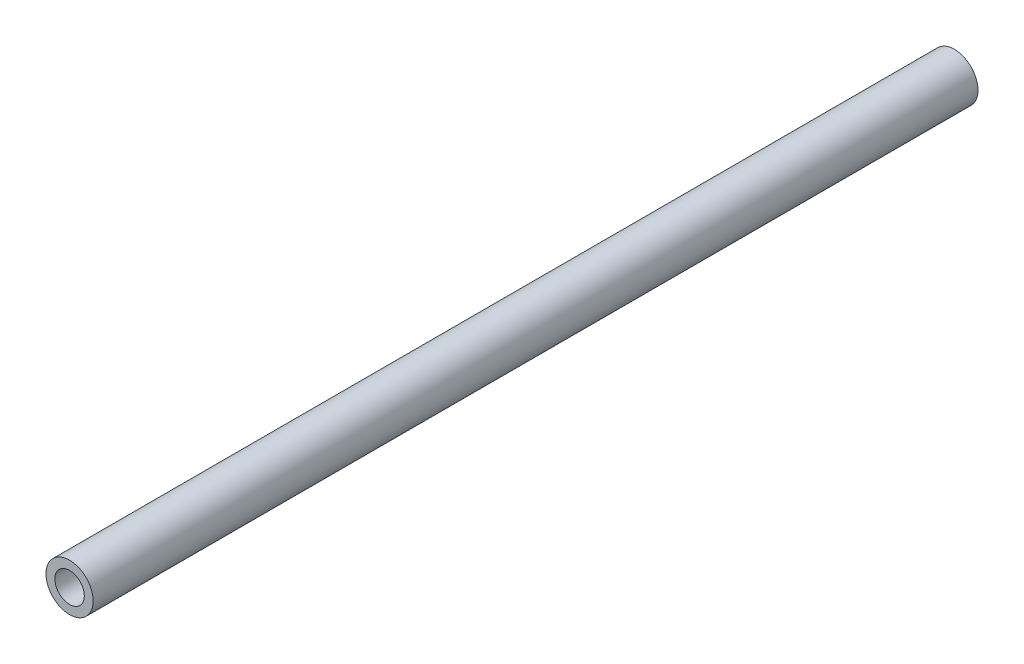
ISO-10303-21;
HEADER;
FILE_DESCRIPTION(('STEP AP214'),'2;1');
FILE_NAME('part.step','',(''),(''),'','','');
FILE_SCHEMA(('AUTOMOTIVE_DESIGN { 1 0 10303 214 1 1 1 1 }'));
ENDSEC;
DATA;
#1=APPLICATION_CONTEXT('core data for automotive mechanical design processes');
#2=APPLICATION_PROTOCOL_DEFINITION('international standard','automotive_design',2000,#1);
#3=PRODUCT_CONTEXT('',#1,'mechanical');
#4=PRODUCT('Part','Part','',(#3));
#5=PRODUCT_RELATED_PRODUCT_CATEGORY('part','',(#4));
#6=PRODUCT_DEFINITION_FORMATION('','',#4);
#7=PRODUCT_DEFINITION_CONTEXT('part definition',#1,'design');
#8=PRODUCT_DEFINITION('design','',#6,#7);
#9=PRODUCT_DEFINITION_SHAPE('','',#8);
#10=(LENGTH_UNIT() NAMED_UNIT(*) SI_UNIT(.MILLI.,.METRE.));
#11=(NAMED_UNIT(*) PLANE_ANGLE_UNIT() SI_UNIT($,.RADIAN.));
#12=(NAMED_UNIT(*) SI_UNIT($,.STERADIAN.) SOLID_ANGLE_UNIT());
#13=UNCERTAINTY_MEASURE_WITH_UNIT(LENGTH_MEASURE(1.E-05),#10,'distance_accuracy_value','');
#14=(GEOMETRIC_REPRESENTATION_CONTEXT(3) GLOBAL_UNCERTAINTY_ASSIGNED_CONTEXT((#13)) GLOBAL_UNIT_ASSIGNED_CONTEXT((#10,
#11,#12)) REPRESENTATION_CONTEXT('',''));
#15=CARTESIAN_POINT('',(0.,0.,0.));
#16=DIRECTION('',(0.,0.,1.));
#17=DIRECTION('',(1.,0.,0.));
#18=AXIS2_PLACEMENT_3D('',#15,#16,#17);
#19=CARTESIAN_POINT('',(0.,0.,150.));
#20=DIRECTION('',(0.,0.,-1.));
#21=DIRECTION('',(-1.,0.,0.));
#22=AXIS2_PLACEMENT_3D('',#19,#20,#21);
#23=CYLINDRICAL_SURFACE('',#22,4.);
#24=CARTESIAN_POINT('',(0.,0.,150.));
#25=DIRECTION('',(0.,0.,1.));
#26=DIRECTION('',(1.,0.,0.));
#27=AXIS2_PLACEMENT_3D('',#24,#25,#26);
#28=CIRCLE('',#27,4.);
#29=CARTESIAN_POINT('',(4.,0.,150.));
#30=VERTEX_POINT('',#29);
#31=EDGE_CURVE('E10',#30,#30,#28,.T.);
#32=ORIENTED_EDGE('',*,*,#31,.F.);
#33=EDGE_LOOP('',(#32));
#34=FACE_BOUND('',#33,.T.);
#35=CARTESIAN_POINT('',(0.,0.,0.));
#36=DIRECTION('',(0.,0.,1.));
#37=DIRECTION('',(1.,0.,0.));
#38=AXIS2_PLACEMENT_3D('',#35,#36,#37);
#39=CIRCLE('',#38,4.);
#40=CARTESIAN_POINT('',(4.,0.,0.));
#41=VERTEX_POINT('',#40);
#42=EDGE_CURVE('E50',#41,#41,#39,.T.);
#43=ORIENTED_EDGE('',*,*,#42,.T.);
#44=EDGE_LOOP('',(#43));
#45=FACE_BOUND('',#44,.T.);
#46=ADVANCED_FACE('F43',(#34,#45),#23,.T.);
#47=CARTESIAN_POINT('',(0.,0.,150.));
#48=DIRECTION('',(0.,0.,1.));
#49=DIRECTION('',(1.,0.,0.));
#50=AXIS2_PLACEMENT_3D('',#47,#48,#49);
#51=PLANE('',#50);
#52=CARTESIAN_POINT('',(0.,0.,150.));
#53=DIRECTION('',(0.,0.,1.));
#54=DIRECTION('',(1.,0.,0.));
#55=AXIS2_PLACEMENT_3D('',#52,#53,#54);
#56=CIRCLE('',#55,2.5);
#57=CARTESIAN_POINT('',(2.5,0.,150.));
#58=VERTEX_POINT('',#57);
#59=EDGE_CURVE('E56',#58,#58,#56,.T.);
#60=ORIENTED_EDGE('',*,*,#59,.F.);
#61=EDGE_LOOP('',(#60));
#62=FACE_BOUND('',#61,.T.);
#63=ORIENTED_EDGE('',*,*,#31,.T.);
#64=EDGE_LOOP('',(#63));
#65=FACE_BOUND('',#64,.T.);
#66=ADVANCED_FACE('F72',(#62,#65),#51,.T.);
#67=CARTESIAN_POINT('',(0.,0.,0.));
#68=DIRECTION('',(0.,0.,1.));
#69=DIRECTION('',(1.,0.,0.));
#70=AXIS2_PLACEMENT_3D('',#67,#68,#69);
#71=PLANE('',#70);
#72=CARTESIAN_POINT('',(0.,0.,0.));
#73=DIRECTION('',(0.,0.,1.));
#74=DIRECTION('',(1.,0.,0.));
#75=AXIS2_PLACEMENT_3D('',#72,#73,#74);
#76=CIRCLE('',#75,2.5);
#77=CARTESIAN_POINT('',(2.5,0.,0.));
#78=VERTEX_POINT('',#77);
#79=EDGE_CURVE('E46',#78,#78,#76,.T.);
#80=ORIENTED_EDGE('',*,*,#79,.T.);
#81=EDGE_LOOP('',(#80));
#82=FACE_BOUND('',#81,.T.);
#83=ORIENTED_EDGE('',*,*,#42,.F.);
#84=EDGE_LOOP('',(#83));
#85=FACE_BOUND('',#84,.T.);
#86=ADVANCED_FACE('F63',(#82,#85),#71,.F.);
#87=CARTESIAN_POINT('',(0.,0.,-180.));
#88=DIRECTION('',(0.,0.,1.));
#89=DIRECTION('',(1.,0.,0.));
#90=AXIS2_PLACEMENT_3D('',#87,#88,#89);
#91=CYLINDRICAL_SURFACE('',#90,2.5);
#92=ORIENTED_EDGE('',*,*,#59,.T.);
#93=EDGE_LOOP('',(#92));
#94=FACE_BOUND('',#93,.T.);
#95=ORIENTED_EDGE('',*,*,#79,.F.);
#96=EDGE_LOOP('',(#95));
#97=FACE_BOUND('',#96,.T.);
#98=ADVANCED_FACE('F66',(#94,#97),#91,.F.);
#99=CLOSED_SHELL('',(#46,#66,#86,#98));
#100=MANIFOLD_SOLID_BREP('B2',#99);
#101=ADVANCED_BREP_SHAPE_REPRESENTATION('',(#18,#100),#14);
#102=SHAPE_DEFINITION_REPRESENTATION(#9,#101);
ENDSEC;
END-ISO-10303-21;
